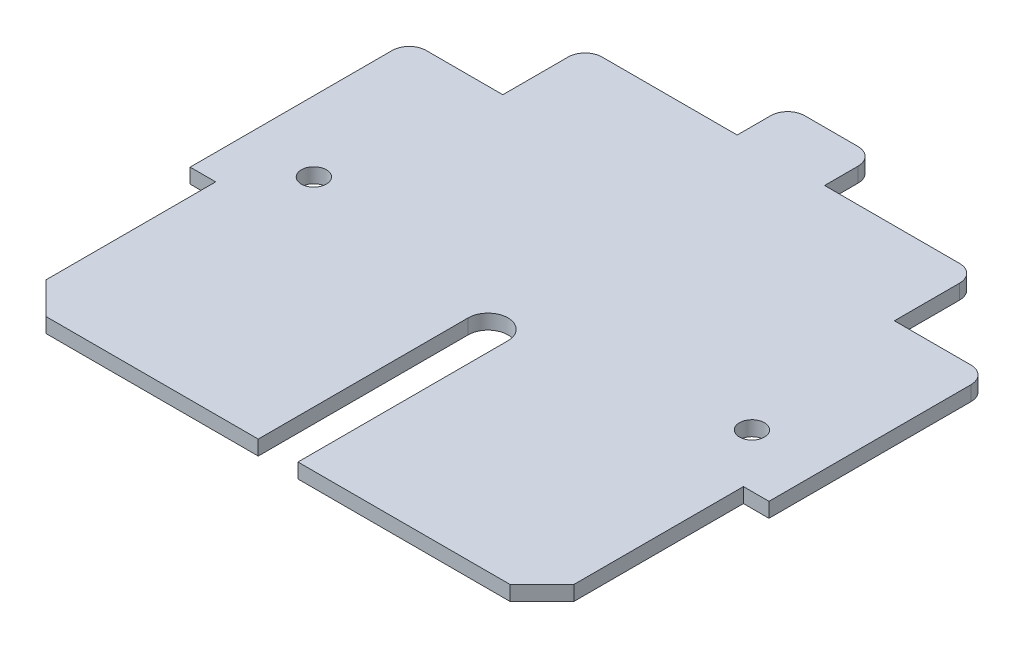
ISO-10303-21;
HEADER;
FILE_DESCRIPTION(('STEP AP214'),'2;1');
FILE_NAME('part.step','',(''),(''),'','','');
FILE_SCHEMA(('AUTOMOTIVE_DESIGN { 1 0 10303 214 1 1 1 1 }'));
ENDSEC;
DATA;
#1=APPLICATION_CONTEXT('core data for automotive mechanical design processes');
#2=APPLICATION_PROTOCOL_DEFINITION('international standard','automotive_design',2000,#1);
#3=PRODUCT_CONTEXT('',#1,'mechanical');
#4=PRODUCT('Part','Part','',(#3));
#5=PRODUCT_RELATED_PRODUCT_CATEGORY('part','',(#4));
#6=PRODUCT_DEFINITION_FORMATION('','',#4);
#7=PRODUCT_DEFINITION_CONTEXT('part definition',#1,'design');
#8=PRODUCT_DEFINITION('design','',#6,#7);
#9=PRODUCT_DEFINITION_SHAPE('','',#8);
#10=(LENGTH_UNIT() NAMED_UNIT(*) SI_UNIT(.MILLI.,.METRE.));
#11=(NAMED_UNIT(*) PLANE_ANGLE_UNIT() SI_UNIT($,.RADIAN.));
#12=(NAMED_UNIT(*) SI_UNIT($,.STERADIAN.) SOLID_ANGLE_UNIT());
#13=UNCERTAINTY_MEASURE_WITH_UNIT(LENGTH_MEASURE(1.E-05),#10,'distance_accuracy_value','');
#14=(GEOMETRIC_REPRESENTATION_CONTEXT(3) GLOBAL_UNCERTAINTY_ASSIGNED_CONTEXT((#13)) GLOBAL_UNIT_ASSIGNED_CONTEXT((#10,
#11,#12)) REPRESENTATION_CONTEXT('',''));
#15=CARTESIAN_POINT('',(0.,0.,0.));
#16=DIRECTION('',(0.,0.,1.));
#17=DIRECTION('',(1.,0.,0.));
#18=AXIS2_PLACEMENT_3D('',#15,#16,#17);
#19=CARTESIAN_POINT('',(24.,0.65,-11.175));
#20=DIRECTION('',(0.,1.,0.));
#21=DIRECTION('',(0.,0.,1.));
#22=AXIS2_PLACEMENT_3D('',#19,#20,#21);
#23=PLANE('',#22);
#24=CARTESIAN_POINT('',(19.3,0.65,1.925));
#25=DIRECTION('',(0.,1.,0.));
#26=DIRECTION('',(0.,0.,1.));
#27=AXIS2_PLACEMENT_3D('',#24,#25,#26);
#28=CIRCLE('',#27,1.1);
#29=CARTESIAN_POINT('',(19.3,0.65,3.025));
#30=VERTEX_POINT('',#29);
#31=EDGE_CURVE('E264',#30,#30,#28,.T.);
#32=ORIENTED_EDGE('',*,*,#31,.F.);
#33=EDGE_LOOP('',(#32));
#34=FACE_BOUND('',#33,.T.);
#35=DIRECTION('',(1.,0.,0.));
#36=VECTOR('',#35,1.);
#37=CARTESIAN_POINT('',(1.75000000000001,0.65,24.375));
#38=LINE('',#37,#36);
#39=CARTESIAN_POINT('',(1.75000000000001,0.65,24.375));
#40=VERTEX_POINT('',#39);
#41=CARTESIAN_POINT('',(20.45,0.65,24.375));
#42=VERTEX_POINT('',#41);
#43=EDGE_CURVE('E344',#40,#42,#38,.T.);
#44=ORIENTED_EDGE('',*,*,#43,.T.);
#45=DIRECTION('',(0.707106781186545,0.,-0.70710678118655));
#46=VECTOR('',#45,1.);
#47=CARTESIAN_POINT('',(20.45,0.65,24.375));
#48=LINE('',#47,#46);
#49=CARTESIAN_POINT('',(23.25,0.65,21.575));
#50=VERTEX_POINT('',#49);
#51=EDGE_CURVE('E157',#42,#50,#48,.T.);
#52=ORIENTED_EDGE('',*,*,#51,.T.);
#53=DIRECTION('',(0.,0.,-1.));
#54=VECTOR('',#53,1.);
#55=CARTESIAN_POINT('',(23.25,0.65,21.575));
#56=LINE('',#55,#54);
#57=CARTESIAN_POINT('',(23.25,0.65,6.625));
#58=VERTEX_POINT('',#57);
#59=EDGE_CURVE('E445',#50,#58,#56,.T.);
#60=ORIENTED_EDGE('',*,*,#59,.T.);
#61=DIRECTION('',(1.,0.,0.));
#62=VECTOR('',#61,1.);
#63=CARTESIAN_POINT('',(23.25,0.65,6.625));
#64=LINE('',#63,#62);
#65=CARTESIAN_POINT('',(25.5,0.65,6.625));
#66=VERTEX_POINT('',#65);
#67=EDGE_CURVE('E467',#58,#66,#64,.T.);
#68=ORIENTED_EDGE('',*,*,#67,.T.);
#69=DIRECTION('',(0.,0.,-1.));
#70=VECTOR('',#69,1.);
#71=CARTESIAN_POINT('',(25.5,0.65,-11.175));
#72=LINE('',#71,#70);
#73=CARTESIAN_POINT('',(25.5,0.65,-11.175));
#74=VERTEX_POINT('',#73);
#75=EDGE_CURVE('E463',#66,#74,#72,.T.);
#76=ORIENTED_EDGE('',*,*,#75,.T.);
#77=CARTESIAN_POINT('',(24.,0.65,-11.175));
#78=DIRECTION('',(0.,1.,0.));
#79=DIRECTION('',(0.,0.,1.));
#80=AXIS2_PLACEMENT_3D('',#77,#78,#79);
#81=CIRCLE('',#80,1.5);
#82=CARTESIAN_POINT('',(24.,0.65,-12.675));
#83=VERTEX_POINT('',#82);
#84=EDGE_CURVE('E466',#74,#83,#81,.T.);
#85=ORIENTED_EDGE('',*,*,#84,.T.);
#86=DIRECTION('',(-1.,0.,0.));
#87=VECTOR('',#86,1.);
#88=CARTESIAN_POINT('',(24.,0.65,-12.675));
#89=LINE('',#88,#87);
#90=CARTESIAN_POINT('',(17.25,0.65,-12.675));
#91=VERTEX_POINT('',#90);
#92=EDGE_CURVE('E472',#83,#91,#89,.T.);
#93=ORIENTED_EDGE('',*,*,#92,.T.);
#94=DIRECTION('',(0.,0.,-1.));
#95=VECTOR('',#94,1.);
#96=CARTESIAN_POINT('',(17.25,0.65,-12.675));
#97=LINE('',#96,#95);
#98=CARTESIAN_POINT('',(17.25,0.65,-18.425));
#99=VERTEX_POINT('',#98);
#100=EDGE_CURVE('E479',#91,#99,#97,.T.);
#101=ORIENTED_EDGE('',*,*,#100,.T.);
#102=CARTESIAN_POINT('',(15.75,0.65,-18.425));
#103=DIRECTION('',(0.,1.,0.));
#104=DIRECTION('',(0.,0.,1.));
#105=AXIS2_PLACEMENT_3D('',#102,#103,#104);
#106=CIRCLE('',#105,1.5);
#107=CARTESIAN_POINT('',(15.75,0.65,-19.925));
#108=VERTEX_POINT('',#107);
#109=EDGE_CURVE('E482',#99,#108,#106,.T.);
#110=ORIENTED_EDGE('',*,*,#109,.T.);
#111=DIRECTION('',(-1.,0.,0.));
#112=VECTOR('',#111,1.);
#113=CARTESIAN_POINT('',(15.75,0.65,-19.925));
#114=LINE('',#113,#112);
#115=CARTESIAN_POINT('',(3.85,0.65,-19.925));
#116=VERTEX_POINT('',#115);
#117=EDGE_CURVE('E485',#108,#116,#114,.T.);
#118=ORIENTED_EDGE('',*,*,#117,.T.);
#119=DIRECTION('',(0.,0.,-1.));
#120=VECTOR('',#119,1.);
#121=CARTESIAN_POINT('',(3.85,0.65,-19.925));
#122=LINE('',#121,#120);
#123=CARTESIAN_POINT('',(3.85,0.65,-22.875));
#124=VERTEX_POINT('',#123);
#125=EDGE_CURVE('E488',#116,#124,#122,.T.);
#126=ORIENTED_EDGE('',*,*,#125,.T.);
#127=CARTESIAN_POINT('',(2.35,0.65,-22.875));
#128=DIRECTION('',(0.,1.,0.));
#129=DIRECTION('',(0.,0.,-1.));
#130=AXIS2_PLACEMENT_3D('',#127,#128,#129);
#131=CIRCLE('',#130,1.5);
#132=CARTESIAN_POINT('',(2.34999999999999,0.65,-24.375));
#133=VERTEX_POINT('',#132);
#134=EDGE_CURVE('E491',#124,#133,#131,.T.);
#135=ORIENTED_EDGE('',*,*,#134,.T.);
#136=DIRECTION('',(-1.,0.,0.));
#137=VECTOR('',#136,1.);
#138=CARTESIAN_POINT('',(-2.34999999999999,0.65,-24.375));
#139=LINE('',#138,#137);
#140=CARTESIAN_POINT('',(-2.34999999999999,0.65,-24.375));
#141=VERTEX_POINT('',#140);
#142=EDGE_CURVE('E494',#133,#141,#139,.T.);
#143=ORIENTED_EDGE('',*,*,#142,.T.);
#144=CARTESIAN_POINT('',(-2.35,0.65,-22.875));
#145=DIRECTION('',(0.,1.,0.));
#146=DIRECTION('',(0.,0.,-1.));
#147=AXIS2_PLACEMENT_3D('',#144,#145,#146);
#148=CIRCLE('',#147,1.5);
#149=CARTESIAN_POINT('',(-3.85,0.65,-22.875));
#150=VERTEX_POINT('',#149);
#151=EDGE_CURVE('E497',#141,#150,#148,.T.);
#152=ORIENTED_EDGE('',*,*,#151,.T.);
#153=DIRECTION('',(0.,0.,1.));
#154=VECTOR('',#153,1.);
#155=CARTESIAN_POINT('',(-3.85,0.65,-19.925));
#156=LINE('',#155,#154);
#157=CARTESIAN_POINT('',(-3.85,0.65,-19.925));
#158=VERTEX_POINT('',#157);
#159=EDGE_CURVE('E500',#150,#158,#156,.T.);
#160=ORIENTED_EDGE('',*,*,#159,.T.);
#161=DIRECTION('',(-1.,0.,0.));
#162=VECTOR('',#161,1.);
#163=CARTESIAN_POINT('',(-15.75,0.65,-19.925));
#164=LINE('',#163,#162);
#165=CARTESIAN_POINT('',(-15.75,0.65,-19.925));
#166=VERTEX_POINT('',#165);
#167=EDGE_CURVE('E503',#158,#166,#164,.T.);
#168=ORIENTED_EDGE('',*,*,#167,.T.);
#169=CARTESIAN_POINT('',(-15.75,0.65,-18.425));
#170=DIRECTION('',(0.,1.,0.));
#171=DIRECTION('',(0.,0.,-1.));
#172=AXIS2_PLACEMENT_3D('',#169,#170,#171);
#173=CIRCLE('',#172,1.5);
#174=CARTESIAN_POINT('',(-17.25,0.65,-18.425));
#175=VERTEX_POINT('',#174);
#176=EDGE_CURVE('E506',#166,#175,#173,.T.);
#177=ORIENTED_EDGE('',*,*,#176,.T.);
#178=DIRECTION('',(0.,0.,1.));
#179=VECTOR('',#178,1.);
#180=CARTESIAN_POINT('',(-17.25,0.65,-12.675));
#181=LINE('',#180,#179);
#182=CARTESIAN_POINT('',(-17.25,0.65,-12.675));
#183=VERTEX_POINT('',#182);
#184=EDGE_CURVE('E509',#175,#183,#181,.T.);
#185=ORIENTED_EDGE('',*,*,#184,.T.);
#186=DIRECTION('',(-1.,0.,0.));
#187=VECTOR('',#186,1.);
#188=CARTESIAN_POINT('',(-24.,0.65,-12.675));
#189=LINE('',#188,#187);
#190=CARTESIAN_POINT('',(-24.,0.65,-12.675));
#191=VERTEX_POINT('',#190);
#192=EDGE_CURVE('E512',#183,#191,#189,.T.);
#193=ORIENTED_EDGE('',*,*,#192,.T.);
#194=CARTESIAN_POINT('',(-24.,0.65,-11.175));
#195=DIRECTION('',(0.,1.,0.));
#196=DIRECTION('',(0.,0.,-1.));
#197=AXIS2_PLACEMENT_3D('',#194,#195,#196);
#198=CIRCLE('',#197,1.5);
#199=CARTESIAN_POINT('',(-25.5,0.65,-11.175));
#200=VERTEX_POINT('',#199);
#201=EDGE_CURVE('E515',#191,#200,#198,.T.);
#202=ORIENTED_EDGE('',*,*,#201,.T.);
#203=DIRECTION('',(0.,0.,1.));
#204=VECTOR('',#203,1.);
#205=CARTESIAN_POINT('',(-25.5,0.65,-11.175));
#206=LINE('',#205,#204);
#207=CARTESIAN_POINT('',(-25.5,0.65,6.62500000000001));
#208=VERTEX_POINT('',#207);
#209=EDGE_CURVE('E518',#200,#208,#206,.T.);
#210=ORIENTED_EDGE('',*,*,#209,.T.);
#211=DIRECTION('',(1.,0.,0.));
#212=VECTOR('',#211,1.);
#213=CARTESIAN_POINT('',(-23.25,0.65,6.62500000000001));
#214=LINE('',#213,#212);
#215=CARTESIAN_POINT('',(-23.25,0.65,6.62500000000001));
#216=VERTEX_POINT('',#215);
#217=EDGE_CURVE('E521',#208,#216,#214,.T.);
#218=ORIENTED_EDGE('',*,*,#217,.T.);
#219=DIRECTION('',(0.,0.,1.));
#220=VECTOR('',#219,1.);
#221=CARTESIAN_POINT('',(-23.25,0.65,6.62500000000001));
#222=LINE('',#221,#220);
#223=CARTESIAN_POINT('',(-23.25,0.65,21.575));
#224=VERTEX_POINT('',#223);
#225=EDGE_CURVE('E524',#216,#224,#222,.T.);
#226=ORIENTED_EDGE('',*,*,#225,.T.);
#227=DIRECTION('',(0.707106781186547,0.,0.707106781186548));
#228=VECTOR('',#227,1.);
#229=CARTESIAN_POINT('',(-20.45,0.65,24.375));
#230=LINE('',#229,#228);
#231=CARTESIAN_POINT('',(-20.45,0.65,24.375));
#232=VERTEX_POINT('',#231);
#233=EDGE_CURVE('E527',#224,#232,#230,.T.);
#234=ORIENTED_EDGE('',*,*,#233,.T.);
#235=DIRECTION('',(1.,0.,0.));
#236=VECTOR('',#235,1.);
#237=CARTESIAN_POINT('',(-20.45,0.65,24.375));
#238=LINE('',#237,#236);
#239=CARTESIAN_POINT('',(-1.75,0.65,24.375));
#240=VERTEX_POINT('',#239);
#241=EDGE_CURVE('E236',#232,#240,#238,.T.);
#242=ORIENTED_EDGE('',*,*,#241,.T.);
#243=DIRECTION('',(0.,0.,-1.));
#244=VECTOR('',#243,1.);
#245=CARTESIAN_POINT('',(-1.75,0.65,24.375));
#246=LINE('',#245,#244);
#247=CARTESIAN_POINT('',(-1.75,0.65,5.875));
#248=VERTEX_POINT('',#247);
#249=EDGE_CURVE('E230',#240,#248,#246,.T.);
#250=ORIENTED_EDGE('',*,*,#249,.T.);
#251=CARTESIAN_POINT('',(0.,0.65,5.875));
#252=DIRECTION('',(0.,-1.,0.));
#253=DIRECTION('',(0.,0.,1.));
#254=AXIS2_PLACEMENT_3D('',#251,#252,#253);
#255=CIRCLE('',#254,1.75000000000001);
#256=CARTESIAN_POINT('',(1.75000000000001,0.65,5.875));
#257=VERTEX_POINT('',#256);
#258=EDGE_CURVE('E234',#248,#257,#255,.T.);
#259=ORIENTED_EDGE('',*,*,#258,.T.);
#260=DIRECTION('',(0.,0.,1.));
#261=VECTOR('',#260,1.);
#262=CARTESIAN_POINT('',(1.75000000000001,0.65,24.375));
#263=LINE('',#262,#261);
#264=EDGE_CURVE('E54',#257,#40,#263,.T.);
#265=ORIENTED_EDGE('',*,*,#264,.T.);
#266=EDGE_LOOP('',(#44,#52,#60,#68,#76,#85,#93,#101,#110,#118,#126,#135,#143,#152,#160,#168,
#177,#185,#193,#202,#210,#218,#226,#234,#242,#250,#259,#265));
#267=FACE_BOUND('',#266,.T.);
#268=CARTESIAN_POINT('',(-19.3,0.65,1.92500000000001));
#269=DIRECTION('',(0.,1.,0.));
#270=DIRECTION('',(0.,0.,-1.));
#271=AXIS2_PLACEMENT_3D('',#268,#269,#270);
#272=CIRCLE('',#271,1.1);
#273=CARTESIAN_POINT('',(-19.3,0.65,0.825000000000007));
#274=VERTEX_POINT('',#273);
#275=EDGE_CURVE('E945',#274,#274,#272,.T.);
#276=ORIENTED_EDGE('',*,*,#275,.F.);
#277=EDGE_LOOP('',(#276));
#278=FACE_BOUND('',#277,.T.);
#279=ADVANCED_FACE('F36',(#34,#267,#278),#23,.T.);
#280=CARTESIAN_POINT('',(24.,-0.65,-11.175));
#281=DIRECTION('',(0.,1.,0.));
#282=DIRECTION('',(0.,0.,1.));
#283=AXIS2_PLACEMENT_3D('',#280,#281,#282);
#284=PLANE('',#283);
#285=DIRECTION('',(1.,0.,0.));
#286=VECTOR('',#285,1.);
#287=CARTESIAN_POINT('',(1.75000000000001,-0.65,24.375));
#288=LINE('',#287,#286);
#289=CARTESIAN_POINT('',(1.75000000000001,-0.65,24.375));
#290=VERTEX_POINT('',#289);
#291=CARTESIAN_POINT('',(20.45,-0.65,24.375));
#292=VERTEX_POINT('',#291);
#293=EDGE_CURVE('E259',#290,#292,#288,.T.);
#294=ORIENTED_EDGE('',*,*,#293,.F.);
#295=DIRECTION('',(0.,0.,1.));
#296=VECTOR('',#295,1.);
#297=CARTESIAN_POINT('',(1.75000000000001,-0.65,24.375));
#298=LINE('',#297,#296);
#299=CARTESIAN_POINT('',(1.75000000000001,-0.65,5.875));
#300=VERTEX_POINT('',#299);
#301=EDGE_CURVE('E149',#300,#290,#298,.T.);
#302=ORIENTED_EDGE('',*,*,#301,.F.);
#303=CARTESIAN_POINT('',(0.,-0.65,5.875));
#304=DIRECTION('',(0.,-1.,0.));
#305=DIRECTION('',(0.,0.,1.));
#306=AXIS2_PLACEMENT_3D('',#303,#304,#305);
#307=CIRCLE('',#306,1.75000000000001);
#308=CARTESIAN_POINT('',(-1.75,-0.65,5.875));
#309=VERTEX_POINT('',#308);
#310=EDGE_CURVE('E143',#309,#300,#307,.T.);
#311=ORIENTED_EDGE('',*,*,#310,.F.);
#312=DIRECTION('',(0.,0.,-1.));
#313=VECTOR('',#312,1.);
#314=CARTESIAN_POINT('',(-1.75,-0.65,24.375));
#315=LINE('',#314,#313);
#316=CARTESIAN_POINT('',(-1.75,-0.65,24.375));
#317=VERTEX_POINT('',#316);
#318=EDGE_CURVE('E245',#317,#309,#315,.T.);
#319=ORIENTED_EDGE('',*,*,#318,.F.);
#320=DIRECTION('',(1.,0.,0.));
#321=VECTOR('',#320,1.);
#322=CARTESIAN_POINT('',(-20.45,-0.65,24.375));
#323=LINE('',#322,#321);
#324=CARTESIAN_POINT('',(-20.45,-0.65,24.375));
#325=VERTEX_POINT('',#324);
#326=EDGE_CURVE('E335',#325,#317,#323,.T.);
#327=ORIENTED_EDGE('',*,*,#326,.F.);
#328=DIRECTION('',(0.707106781186547,0.,0.707106781186548));
#329=VECTOR('',#328,1.);
#330=CARTESIAN_POINT('',(-20.45,-0.65,24.375));
#331=LINE('',#330,#329);
#332=CARTESIAN_POINT('',(-23.25,-0.65,21.575));
#333=VERTEX_POINT('',#332);
#334=EDGE_CURVE('E332',#333,#325,#331,.T.);
#335=ORIENTED_EDGE('',*,*,#334,.F.);
#336=DIRECTION('',(0.,0.,1.));
#337=VECTOR('',#336,1.);
#338=CARTESIAN_POINT('',(-23.25,-0.65,21.575));
#339=LINE('',#338,#337);
#340=CARTESIAN_POINT('',(-23.25,-0.65,6.62500000000001));
#341=VERTEX_POINT('',#340);
#342=EDGE_CURVE('E329',#341,#333,#339,.T.);
#343=ORIENTED_EDGE('',*,*,#342,.F.);
#344=DIRECTION('',(1.,0.,0.));
#345=VECTOR('',#344,1.);
#346=CARTESIAN_POINT('',(-23.25,-0.65,6.62500000000001));
#347=LINE('',#346,#345);
#348=CARTESIAN_POINT('',(-25.5,-0.65,6.62500000000001));
#349=VERTEX_POINT('',#348);
#350=EDGE_CURVE('E325',#349,#341,#347,.T.);
#351=ORIENTED_EDGE('',*,*,#350,.F.);
#352=DIRECTION('',(0.,0.,1.));
#353=VECTOR('',#352,1.);
#354=CARTESIAN_POINT('',(-25.5,-0.65,-11.175));
#355=LINE('',#354,#353);
#356=CARTESIAN_POINT('',(-25.5,-0.65,-11.175));
#357=VERTEX_POINT('',#356);
#358=EDGE_CURVE('E322',#357,#349,#355,.T.);
#359=ORIENTED_EDGE('',*,*,#358,.F.);
#360=CARTESIAN_POINT('',(-24.,-0.65,-11.175));
#361=DIRECTION('',(0.,1.,0.));
#362=DIRECTION('',(0.,0.,-1.));
#363=AXIS2_PLACEMENT_3D('',#360,#361,#362);
#364=CIRCLE('',#363,1.5);
#365=CARTESIAN_POINT('',(-24.,-0.65,-12.675));
#366=VERTEX_POINT('',#365);
#367=EDGE_CURVE('E319',#366,#357,#364,.T.);
#368=ORIENTED_EDGE('',*,*,#367,.F.);
#369=DIRECTION('',(-1.,0.,0.));
#370=VECTOR('',#369,1.);
#371=CARTESIAN_POINT('',(-24.,-0.65,-12.675));
#372=LINE('',#371,#370);
#373=CARTESIAN_POINT('',(-17.25,-0.65,-12.675));
#374=VERTEX_POINT('',#373);
#375=EDGE_CURVE('E316',#374,#366,#372,.T.);
#376=ORIENTED_EDGE('',*,*,#375,.F.);
#377=DIRECTION('',(0.,0.,1.));
#378=VECTOR('',#377,1.);
#379=CARTESIAN_POINT('',(-17.25,-0.65,-12.675));
#380=LINE('',#379,#378);
#381=CARTESIAN_POINT('',(-17.25,-0.65,-18.425));
#382=VERTEX_POINT('',#381);
#383=EDGE_CURVE('E313',#382,#374,#380,.T.);
#384=ORIENTED_EDGE('',*,*,#383,.F.);
#385=CARTESIAN_POINT('',(-15.75,-0.65,-18.425));
#386=DIRECTION('',(0.,1.,0.));
#387=DIRECTION('',(0.,0.,-1.));
#388=AXIS2_PLACEMENT_3D('',#385,#386,#387);
#389=CIRCLE('',#388,1.5);
#390=CARTESIAN_POINT('',(-15.75,-0.65,-19.925));
#391=VERTEX_POINT('',#390);
#392=EDGE_CURVE('E310',#391,#382,#389,.T.);
#393=ORIENTED_EDGE('',*,*,#392,.F.);
#394=DIRECTION('',(-1.,0.,0.));
#395=VECTOR('',#394,1.);
#396=CARTESIAN_POINT('',(-15.75,-0.65,-19.925));
#397=LINE('',#396,#395);
#398=CARTESIAN_POINT('',(-3.85,-0.65,-19.925));
#399=VERTEX_POINT('',#398);
#400=EDGE_CURVE('E307',#399,#391,#397,.T.);
#401=ORIENTED_EDGE('',*,*,#400,.F.);
#402=DIRECTION('',(0.,0.,1.));
#403=VECTOR('',#402,1.);
#404=CARTESIAN_POINT('',(-3.85,-0.65,-19.925));
#405=LINE('',#404,#403);
#406=CARTESIAN_POINT('',(-3.85,-0.65,-22.875));
#407=VERTEX_POINT('',#406);
#408=EDGE_CURVE('E304',#407,#399,#405,.T.);
#409=ORIENTED_EDGE('',*,*,#408,.F.);
#410=CARTESIAN_POINT('',(-2.35,-0.65,-22.875));
#411=DIRECTION('',(0.,1.,0.));
#412=DIRECTION('',(0.,0.,-1.));
#413=AXIS2_PLACEMENT_3D('',#410,#411,#412);
#414=CIRCLE('',#413,1.5);
#415=CARTESIAN_POINT('',(-2.34999999999999,-0.65,-24.375));
#416=VERTEX_POINT('',#415);
#417=EDGE_CURVE('E301',#416,#407,#414,.T.);
#418=ORIENTED_EDGE('',*,*,#417,.F.);
#419=DIRECTION('',(-1.,0.,0.));
#420=VECTOR('',#419,1.);
#421=CARTESIAN_POINT('',(-2.34999999999999,-0.65,-24.375));
#422=LINE('',#421,#420);
#423=CARTESIAN_POINT('',(2.34999999999999,-0.65,-24.375));
#424=VERTEX_POINT('',#423);
#425=EDGE_CURVE('E298',#424,#416,#422,.T.);
#426=ORIENTED_EDGE('',*,*,#425,.F.);
#427=CARTESIAN_POINT('',(2.35,-0.65,-22.875));
#428=DIRECTION('',(0.,1.,0.));
#429=DIRECTION('',(0.,0.,-1.));
#430=AXIS2_PLACEMENT_3D('',#427,#428,#429);
#431=CIRCLE('',#430,1.5);
#432=CARTESIAN_POINT('',(3.85,-0.65,-22.875));
#433=VERTEX_POINT('',#432);
#434=EDGE_CURVE('E295',#433,#424,#431,.T.);
#435=ORIENTED_EDGE('',*,*,#434,.F.);
#436=DIRECTION('',(0.,0.,-1.));
#437=VECTOR('',#436,1.);
#438=CARTESIAN_POINT('',(3.85,-0.65,-19.925));
#439=LINE('',#438,#437);
#440=CARTESIAN_POINT('',(3.85,-0.65,-19.925));
#441=VERTEX_POINT('',#440);
#442=EDGE_CURVE('E292',#441,#433,#439,.T.);
#443=ORIENTED_EDGE('',*,*,#442,.F.);
#444=DIRECTION('',(-1.,0.,0.));
#445=VECTOR('',#444,1.);
#446=CARTESIAN_POINT('',(15.75,-0.65,-19.925));
#447=LINE('',#446,#445);
#448=CARTESIAN_POINT('',(15.75,-0.65,-19.925));
#449=VERTEX_POINT('',#448);
#450=EDGE_CURVE('E289',#449,#441,#447,.T.);
#451=ORIENTED_EDGE('',*,*,#450,.F.);
#452=CARTESIAN_POINT('',(15.75,-0.65,-18.425));
#453=DIRECTION('',(0.,1.,0.));
#454=DIRECTION('',(0.,0.,1.));
#455=AXIS2_PLACEMENT_3D('',#452,#453,#454);
#456=CIRCLE('',#455,1.5);
#457=CARTESIAN_POINT('',(17.25,-0.65,-18.425));
#458=VERTEX_POINT('',#457);
#459=EDGE_CURVE('E286',#458,#449,#456,.T.);
#460=ORIENTED_EDGE('',*,*,#459,.F.);
#461=DIRECTION('',(0.,0.,-1.));
#462=VECTOR('',#461,1.);
#463=CARTESIAN_POINT('',(17.25,-0.65,-12.675));
#464=LINE('',#463,#462);
#465=CARTESIAN_POINT('',(17.25,-0.65,-12.675));
#466=VERTEX_POINT('',#465);
#467=EDGE_CURVE('E283',#466,#458,#464,.T.);
#468=ORIENTED_EDGE('',*,*,#467,.F.);
#469=DIRECTION('',(-1.,0.,0.));
#470=VECTOR('',#469,1.);
#471=CARTESIAN_POINT('',(24.,-0.65,-12.675));
#472=LINE('',#471,#470);
#473=CARTESIAN_POINT('',(24.,-0.65,-12.675));
#474=VERTEX_POINT('',#473);
#475=EDGE_CURVE('E280',#474,#466,#472,.T.);
#476=ORIENTED_EDGE('',*,*,#475,.F.);
#477=CARTESIAN_POINT('',(24.,-0.65,-11.175));
#478=DIRECTION('',(0.,1.,0.));
#479=DIRECTION('',(0.,0.,1.));
#480=AXIS2_PLACEMENT_3D('',#477,#478,#479);
#481=CIRCLE('',#480,1.5);
#482=CARTESIAN_POINT('',(25.5,-0.65,-11.175));
#483=VERTEX_POINT('',#482);
#484=EDGE_CURVE('E277',#483,#474,#481,.T.);
#485=ORIENTED_EDGE('',*,*,#484,.F.);
#486=DIRECTION('',(0.,0.,-1.));
#487=VECTOR('',#486,1.);
#488=CARTESIAN_POINT('',(25.5,-0.65,-11.175));
#489=LINE('',#488,#487);
#490=CARTESIAN_POINT('',(25.5,-0.65,6.625));
#491=VERTEX_POINT('',#490);
#492=EDGE_CURVE('E274',#491,#483,#489,.T.);
#493=ORIENTED_EDGE('',*,*,#492,.F.);
#494=DIRECTION('',(1.,0.,0.));
#495=VECTOR('',#494,1.);
#496=CARTESIAN_POINT('',(23.25,-0.65,6.625));
#497=LINE('',#496,#495);
#498=CARTESIAN_POINT('',(23.25,-0.65,6.625));
#499=VERTEX_POINT('',#498);
#500=EDGE_CURVE('E271',#499,#491,#497,.T.);
#501=ORIENTED_EDGE('',*,*,#500,.F.);
#502=DIRECTION('',(0.,0.,-1.));
#503=VECTOR('',#502,1.);
#504=CARTESIAN_POINT('',(23.25,-0.65,8.875));
#505=LINE('',#504,#503);
#506=CARTESIAN_POINT('',(23.25,-0.65,21.575));
#507=VERTEX_POINT('',#506);
#508=EDGE_CURVE('E268',#507,#499,#505,.T.);
#509=ORIENTED_EDGE('',*,*,#508,.F.);
#510=DIRECTION('',(0.707106781186545,0.,-0.70710678118655));
#511=VECTOR('',#510,1.);
#512=CARTESIAN_POINT('',(20.45,-0.65,24.375));
#513=LINE('',#512,#511);
#514=EDGE_CURVE('E263',#292,#507,#513,.T.);
#515=ORIENTED_EDGE('',*,*,#514,.F.);
#516=EDGE_LOOP('',(#294,#302,#311,#319,#327,#335,#343,#351,#359,#368,#376,#384,#393,#401,#409,
#418,#426,#435,#443,#451,#460,#468,#476,#485,#493,#501,#509,#515));
#517=FACE_BOUND('',#516,.T.);
#518=CARTESIAN_POINT('',(19.3,-0.65,1.925));
#519=DIRECTION('',(0.,1.,0.));
#520=DIRECTION('',(0.,0.,1.));
#521=AXIS2_PLACEMENT_3D('',#518,#519,#520);
#522=CIRCLE('',#521,1.1);
#523=CARTESIAN_POINT('',(19.3,-0.65,3.025));
#524=VERTEX_POINT('',#523);
#525=EDGE_CURVE('E937',#524,#524,#522,.T.);
#526=ORIENTED_EDGE('',*,*,#525,.T.);
#527=EDGE_LOOP('',(#526));
#528=FACE_BOUND('',#527,.T.);
#529=CARTESIAN_POINT('',(-19.3,-0.65,1.92500000000001));
#530=DIRECTION('',(0.,1.,0.));
#531=DIRECTION('',(0.,0.,-1.));
#532=AXIS2_PLACEMENT_3D('',#529,#530,#531);
#533=CIRCLE('',#532,1.1);
#534=CARTESIAN_POINT('',(-19.3,-0.65,0.825000000000007));
#535=VERTEX_POINT('',#534);
#536=EDGE_CURVE('E949',#535,#535,#533,.T.);
#537=ORIENTED_EDGE('',*,*,#536,.T.);
#538=EDGE_LOOP('',(#537));
#539=FACE_BOUND('',#538,.T.);
#540=ADVANCED_FACE('F450',(#517,#528,#539),#284,.F.);
#541=CARTESIAN_POINT('',(1.75000000000001,0.65,24.375));
#542=DIRECTION('',(0.,0.,-1.));
#543=DIRECTION('',(-1.,0.,0.));
#544=AXIS2_PLACEMENT_3D('',#541,#542,#543);
#545=PLANE('',#544);
#546=ORIENTED_EDGE('',*,*,#293,.T.);
#547=DIRECTION('',(0.,-1.,0.));
#548=VECTOR('',#547,1.);
#549=CARTESIAN_POINT('',(20.45,0.65,24.375));
#550=LINE('',#549,#548);
#551=EDGE_CURVE('E11',#42,#292,#550,.T.);
#552=ORIENTED_EDGE('',*,*,#551,.F.);
#553=ORIENTED_EDGE('',*,*,#43,.F.);
#554=DIRECTION('',(0.,-1.,0.));
#555=VECTOR('',#554,1.);
#556=CARTESIAN_POINT('',(1.75000000000001,0.65,24.375));
#557=LINE('',#556,#555);
#558=EDGE_CURVE('E255',#40,#290,#557,.T.);
#559=ORIENTED_EDGE('',*,*,#558,.T.);
#560=EDGE_LOOP('',(#546,#552,#553,#559));
#561=FACE_BOUND('',#560,.T.);
#562=ADVANCED_FACE('F38',(#561),#545,.F.);
#563=CARTESIAN_POINT('',(20.45,0.65,24.375));
#564=DIRECTION('',(-0.70710678118655,0.,-0.707106781186545));
#565=DIRECTION('',(-0.707106781186545,0.,0.70710678118655));
#566=AXIS2_PLACEMENT_3D('',#563,#564,#565);
#567=PLANE('',#566);
#568=ORIENTED_EDGE('',*,*,#514,.T.);
#569=DIRECTION('',(0.,-1.,0.));
#570=VECTOR('',#569,1.);
#571=CARTESIAN_POINT('',(23.25,0.65,21.575));
#572=LINE('',#571,#570);
#573=EDGE_CURVE('E46',#50,#507,#572,.T.);
#574=ORIENTED_EDGE('',*,*,#573,.F.);
#575=ORIENTED_EDGE('',*,*,#51,.F.);
#576=ORIENTED_EDGE('',*,*,#551,.T.);
#577=EDGE_LOOP('',(#568,#574,#575,#576));
#578=FACE_BOUND('',#577,.T.);
#579=ADVANCED_FACE('F446',(#578),#567,.F.);
#580=CARTESIAN_POINT('',(23.25,0.65,8.875));
#581=DIRECTION('',(-1.,0.,0.));
#582=DIRECTION('',(0.,0.,1.));
#583=AXIS2_PLACEMENT_3D('',#580,#581,#582);
#584=PLANE('',#583);
#585=ORIENTED_EDGE('',*,*,#508,.T.);
#586=DIRECTION('',(0.,-1.,0.));
#587=VECTOR('',#586,1.);
#588=CARTESIAN_POINT('',(23.25,0.65,6.625));
#589=LINE('',#588,#587);
#590=EDGE_CURVE('E435',#58,#499,#589,.T.);
#591=ORIENTED_EDGE('',*,*,#590,.F.);
#592=ORIENTED_EDGE('',*,*,#59,.F.);
#593=ORIENTED_EDGE('',*,*,#573,.T.);
#594=EDGE_LOOP('',(#585,#591,#592,#593));
#595=FACE_BOUND('',#594,.T.);
#596=ADVANCED_FACE('F443',(#595),#584,.F.);
#597=CARTESIAN_POINT('',(23.25,0.65,6.625));
#598=DIRECTION('',(0.,0.,-1.));
#599=DIRECTION('',(-1.,0.,0.));
#600=AXIS2_PLACEMENT_3D('',#597,#598,#599);
#601=PLANE('',#600);
#602=ORIENTED_EDGE('',*,*,#500,.T.);
#603=DIRECTION('',(0.,-1.,0.));
#604=VECTOR('',#603,1.);
#605=CARTESIAN_POINT('',(25.5,0.65,6.625));
#606=LINE('',#605,#604);
#607=EDGE_CURVE('E431',#66,#491,#606,.T.);
#608=ORIENTED_EDGE('',*,*,#607,.F.);
#609=ORIENTED_EDGE('',*,*,#67,.F.);
#610=ORIENTED_EDGE('',*,*,#590,.T.);
#611=EDGE_LOOP('',(#602,#608,#609,#610));
#612=FACE_BOUND('',#611,.T.);
#613=ADVANCED_FACE('F457',(#612),#601,.F.);
#614=CARTESIAN_POINT('',(25.5,0.65,-11.175));
#615=DIRECTION('',(-1.,0.,0.));
#616=DIRECTION('',(0.,0.,1.));
#617=AXIS2_PLACEMENT_3D('',#614,#615,#616);
#618=PLANE('',#617);
#619=ORIENTED_EDGE('',*,*,#492,.T.);
#620=DIRECTION('',(0.,-1.,0.));
#621=VECTOR('',#620,1.);
#622=CARTESIAN_POINT('',(25.5,0.65,-11.175));
#623=LINE('',#622,#621);
#624=EDGE_CURVE('E427',#74,#483,#623,.T.);
#625=ORIENTED_EDGE('',*,*,#624,.F.);
#626=ORIENTED_EDGE('',*,*,#75,.F.);
#627=ORIENTED_EDGE('',*,*,#607,.T.);
#628=EDGE_LOOP('',(#619,#625,#626,#627));
#629=FACE_BOUND('',#628,.T.);
#630=ADVANCED_FACE('F461',(#629),#618,.F.);
#631=CARTESIAN_POINT('',(24.,0.65,-11.175));
#632=DIRECTION('',(0.,-1.,0.));
#633=DIRECTION('',(0.,0.,-1.));
#634=AXIS2_PLACEMENT_3D('',#631,#632,#633);
#635=CYLINDRICAL_SURFACE('',#634,1.5);
#636=ORIENTED_EDGE('',*,*,#484,.T.);
#637=DIRECTION('',(0.,-1.,0.));
#638=VECTOR('',#637,1.);
#639=CARTESIAN_POINT('',(24.,0.65,-12.675));
#640=LINE('',#639,#638);
#641=EDGE_CURVE('E423',#83,#474,#640,.T.);
#642=ORIENTED_EDGE('',*,*,#641,.F.);
#643=ORIENTED_EDGE('',*,*,#84,.F.);
#644=ORIENTED_EDGE('',*,*,#624,.T.);
#645=EDGE_LOOP('',(#636,#642,#643,#644));
#646=FACE_BOUND('',#645,.T.);
#647=ADVANCED_FACE('F834',(#646),#635,.T.);
#648=CARTESIAN_POINT('',(24.,0.65,-12.675));
#649=DIRECTION('',(0.,0.,1.));
#650=DIRECTION('',(1.,0.,0.));
#651=AXIS2_PLACEMENT_3D('',#648,#649,#650);
#652=PLANE('',#651);
#653=ORIENTED_EDGE('',*,*,#475,.T.);
#654=DIRECTION('',(0.,-1.,0.));
#655=VECTOR('',#654,1.);
#656=CARTESIAN_POINT('',(17.25,0.65,-12.675));
#657=LINE('',#656,#655);
#658=EDGE_CURVE('E419',#91,#466,#657,.T.);
#659=ORIENTED_EDGE('',*,*,#658,.F.);
#660=ORIENTED_EDGE('',*,*,#92,.F.);
#661=ORIENTED_EDGE('',*,*,#641,.T.);
#662=EDGE_LOOP('',(#653,#659,#660,#661));
#663=FACE_BOUND('',#662,.T.);
#664=ADVANCED_FACE('F823',(#663),#652,.F.);
#665=CARTESIAN_POINT('',(17.25,0.65,-12.675));
#666=DIRECTION('',(-1.,0.,0.));
#667=DIRECTION('',(0.,0.,1.));
#668=AXIS2_PLACEMENT_3D('',#665,#666,#667);
#669=PLANE('',#668);
#670=ORIENTED_EDGE('',*,*,#467,.T.);
#671=DIRECTION('',(0.,-1.,0.));
#672=VECTOR('',#671,1.);
#673=CARTESIAN_POINT('',(17.25,0.65,-18.425));
#674=LINE('',#673,#672);
#675=EDGE_CURVE('E415',#99,#458,#674,.T.);
#676=ORIENTED_EDGE('',*,*,#675,.F.);
#677=ORIENTED_EDGE('',*,*,#100,.F.);
#678=ORIENTED_EDGE('',*,*,#658,.T.);
#679=EDGE_LOOP('',(#670,#676,#677,#678));
#680=FACE_BOUND('',#679,.T.);
#681=ADVANCED_FACE('F812',(#680),#669,.F.);
#682=CARTESIAN_POINT('',(15.75,0.65,-18.425));
#683=DIRECTION('',(0.,-1.,0.));
#684=DIRECTION('',(0.,0.,-1.));
#685=AXIS2_PLACEMENT_3D('',#682,#683,#684);
#686=CYLINDRICAL_SURFACE('',#685,1.5);
#687=ORIENTED_EDGE('',*,*,#459,.T.);
#688=DIRECTION('',(0.,-1.,0.));
#689=VECTOR('',#688,1.);
#690=CARTESIAN_POINT('',(15.75,0.65,-19.925));
#691=LINE('',#690,#689);
#692=EDGE_CURVE('E411',#108,#449,#691,.T.);
#693=ORIENTED_EDGE('',*,*,#692,.F.);
#694=ORIENTED_EDGE('',*,*,#109,.F.);
#695=ORIENTED_EDGE('',*,*,#675,.T.);
#696=EDGE_LOOP('',(#687,#693,#694,#695));
#697=FACE_BOUND('',#696,.T.);
#698=ADVANCED_FACE('F801',(#697),#686,.T.);
#699=CARTESIAN_POINT('',(15.75,0.65,-19.925));
#700=DIRECTION('',(0.,0.,1.));
#701=DIRECTION('',(1.,0.,0.));
#702=AXIS2_PLACEMENT_3D('',#699,#700,#701);
#703=PLANE('',#702);
#704=ORIENTED_EDGE('',*,*,#450,.T.);
#705=DIRECTION('',(0.,-1.,0.));
#706=VECTOR('',#705,1.);
#707=CARTESIAN_POINT('',(3.85,0.65,-19.925));
#708=LINE('',#707,#706);
#709=EDGE_CURVE('E407',#116,#441,#708,.T.);
#710=ORIENTED_EDGE('',*,*,#709,.F.);
#711=ORIENTED_EDGE('',*,*,#117,.F.);
#712=ORIENTED_EDGE('',*,*,#692,.T.);
#713=EDGE_LOOP('',(#704,#710,#711,#712));
#714=FACE_BOUND('',#713,.T.);
#715=ADVANCED_FACE('F790',(#714),#703,.F.);
#716=CARTESIAN_POINT('',(3.85,0.65,-19.925));
#717=DIRECTION('',(-1.,0.,0.));
#718=DIRECTION('',(0.,0.,1.));
#719=AXIS2_PLACEMENT_3D('',#716,#717,#718);
#720=PLANE('',#719);
#721=ORIENTED_EDGE('',*,*,#442,.T.);
#722=DIRECTION('',(0.,-1.,0.));
#723=VECTOR('',#722,1.);
#724=CARTESIAN_POINT('',(3.85,0.65,-22.875));
#725=LINE('',#724,#723);
#726=EDGE_CURVE('E403',#124,#433,#725,.T.);
#727=ORIENTED_EDGE('',*,*,#726,.F.);
#728=ORIENTED_EDGE('',*,*,#125,.F.);
#729=ORIENTED_EDGE('',*,*,#709,.T.);
#730=EDGE_LOOP('',(#721,#727,#728,#729));
#731=FACE_BOUND('',#730,.T.);
#732=ADVANCED_FACE('F779',(#731),#720,.F.);
#733=CARTESIAN_POINT('',(2.35,0.65,-22.875));
#734=DIRECTION('',(0.,-1.,0.));
#735=DIRECTION('',(0.,0.,-1.));
#736=AXIS2_PLACEMENT_3D('',#733,#734,#735);
#737=CYLINDRICAL_SURFACE('',#736,1.5);
#738=ORIENTED_EDGE('',*,*,#434,.T.);
#739=DIRECTION('',(0.,-1.,0.));
#740=VECTOR('',#739,1.);
#741=CARTESIAN_POINT('',(2.34999999999999,0.65,-24.375));
#742=LINE('',#741,#740);
#743=EDGE_CURVE('E399',#133,#424,#742,.T.);
#744=ORIENTED_EDGE('',*,*,#743,.F.);
#745=ORIENTED_EDGE('',*,*,#134,.F.);
#746=ORIENTED_EDGE('',*,*,#726,.T.);
#747=EDGE_LOOP('',(#738,#744,#745,#746));
#748=FACE_BOUND('',#747,.T.);
#749=ADVANCED_FACE('F768',(#748),#737,.T.);
#750=CARTESIAN_POINT('',(-2.34999999999999,0.65,-24.375));
#751=DIRECTION('',(0.,0.,1.));
#752=DIRECTION('',(1.,0.,0.));
#753=AXIS2_PLACEMENT_3D('',#750,#751,#752);
#754=PLANE('',#753);
#755=ORIENTED_EDGE('',*,*,#425,.T.);
#756=DIRECTION('',(0.,-1.,0.));
#757=VECTOR('',#756,1.);
#758=CARTESIAN_POINT('',(-2.34999999999999,0.65,-24.375));
#759=LINE('',#758,#757);
#760=EDGE_CURVE('E395',#141,#416,#759,.T.);
#761=ORIENTED_EDGE('',*,*,#760,.F.);
#762=ORIENTED_EDGE('',*,*,#142,.F.);
#763=ORIENTED_EDGE('',*,*,#743,.T.);
#764=EDGE_LOOP('',(#755,#761,#762,#763));
#765=FACE_BOUND('',#764,.T.);
#766=ADVANCED_FACE('F757',(#765),#754,.F.);
#767=CARTESIAN_POINT('',(-2.35,0.65,-22.875));
#768=DIRECTION('',(0.,-1.,0.));
#769=DIRECTION('',(0.,0.,-1.));
#770=AXIS2_PLACEMENT_3D('',#767,#768,#769);
#771=CYLINDRICAL_SURFACE('',#770,1.5);
#772=ORIENTED_EDGE('',*,*,#417,.T.);
#773=DIRECTION('',(0.,-1.,0.));
#774=VECTOR('',#773,1.);
#775=CARTESIAN_POINT('',(-3.85,0.65,-22.875));
#776=LINE('',#775,#774);
#777=EDGE_CURVE('E391',#150,#407,#776,.T.);
#778=ORIENTED_EDGE('',*,*,#777,.F.);
#779=ORIENTED_EDGE('',*,*,#151,.F.);
#780=ORIENTED_EDGE('',*,*,#760,.T.);
#781=EDGE_LOOP('',(#772,#778,#779,#780));
#782=FACE_BOUND('',#781,.T.);
#783=ADVANCED_FACE('F746',(#782),#771,.T.);
#784=CARTESIAN_POINT('',(-3.85,0.65,-19.925));
#785=DIRECTION('',(1.,0.,0.));
#786=DIRECTION('',(0.,0.,-1.));
#787=AXIS2_PLACEMENT_3D('',#784,#785,#786);
#788=PLANE('',#787);
#789=ORIENTED_EDGE('',*,*,#408,.T.);
#790=DIRECTION('',(0.,-1.,0.));
#791=VECTOR('',#790,1.);
#792=CARTESIAN_POINT('',(-3.85,0.65,-19.925));
#793=LINE('',#792,#791);
#794=EDGE_CURVE('E387',#158,#399,#793,.T.);
#795=ORIENTED_EDGE('',*,*,#794,.F.);
#796=ORIENTED_EDGE('',*,*,#159,.F.);
#797=ORIENTED_EDGE('',*,*,#777,.T.);
#798=EDGE_LOOP('',(#789,#795,#796,#797));
#799=FACE_BOUND('',#798,.T.);
#800=ADVANCED_FACE('F735',(#799),#788,.F.);
#801=CARTESIAN_POINT('',(-15.75,0.65,-19.925));
#802=DIRECTION('',(0.,0.,1.));
#803=DIRECTION('',(1.,0.,0.));
#804=AXIS2_PLACEMENT_3D('',#801,#802,#803);
#805=PLANE('',#804);
#806=ORIENTED_EDGE('',*,*,#400,.T.);
#807=DIRECTION('',(0.,-1.,0.));
#808=VECTOR('',#807,1.);
#809=CARTESIAN_POINT('',(-15.75,0.65,-19.925));
#810=LINE('',#809,#808);
#811=EDGE_CURVE('E383',#166,#391,#810,.T.);
#812=ORIENTED_EDGE('',*,*,#811,.F.);
#813=ORIENTED_EDGE('',*,*,#167,.F.);
#814=ORIENTED_EDGE('',*,*,#794,.T.);
#815=EDGE_LOOP('',(#806,#812,#813,#814));
#816=FACE_BOUND('',#815,.T.);
#817=ADVANCED_FACE('F724',(#816),#805,.F.);
#818=CARTESIAN_POINT('',(-15.75,0.65,-18.425));
#819=DIRECTION('',(0.,-1.,0.));
#820=DIRECTION('',(0.,0.,-1.));
#821=AXIS2_PLACEMENT_3D('',#818,#819,#820);
#822=CYLINDRICAL_SURFACE('',#821,1.5);
#823=ORIENTED_EDGE('',*,*,#392,.T.);
#824=DIRECTION('',(0.,-1.,0.));
#825=VECTOR('',#824,1.);
#826=CARTESIAN_POINT('',(-17.25,0.65,-18.425));
#827=LINE('',#826,#825);
#828=EDGE_CURVE('E379',#175,#382,#827,.T.);
#829=ORIENTED_EDGE('',*,*,#828,.F.);
#830=ORIENTED_EDGE('',*,*,#176,.F.);
#831=ORIENTED_EDGE('',*,*,#811,.T.);
#832=EDGE_LOOP('',(#823,#829,#830,#831));
#833=FACE_BOUND('',#832,.T.);
#834=ADVANCED_FACE('F713',(#833),#822,.T.);
#835=CARTESIAN_POINT('',(-17.25,0.65,-12.675));
#836=DIRECTION('',(1.,0.,0.));
#837=DIRECTION('',(0.,0.,-1.));
#838=AXIS2_PLACEMENT_3D('',#835,#836,#837);
#839=PLANE('',#838);
#840=ORIENTED_EDGE('',*,*,#383,.T.);
#841=DIRECTION('',(0.,-1.,0.));
#842=VECTOR('',#841,1.);
#843=CARTESIAN_POINT('',(-17.25,0.65,-12.675));
#844=LINE('',#843,#842);
#845=EDGE_CURVE('E375',#183,#374,#844,.T.);
#846=ORIENTED_EDGE('',*,*,#845,.F.);
#847=ORIENTED_EDGE('',*,*,#184,.F.);
#848=ORIENTED_EDGE('',*,*,#828,.T.);
#849=EDGE_LOOP('',(#840,#846,#847,#848));
#850=FACE_BOUND('',#849,.T.);
#851=ADVANCED_FACE('F702',(#850),#839,.F.);
#852=CARTESIAN_POINT('',(-24.,0.65,-12.675));
#853=DIRECTION('',(0.,0.,1.));
#854=DIRECTION('',(1.,0.,0.));
#855=AXIS2_PLACEMENT_3D('',#852,#853,#854);
#856=PLANE('',#855);
#857=ORIENTED_EDGE('',*,*,#375,.T.);
#858=DIRECTION('',(0.,-1.,0.));
#859=VECTOR('',#858,1.);
#860=CARTESIAN_POINT('',(-24.,0.65,-12.675));
#861=LINE('',#860,#859);
#862=EDGE_CURVE('E371',#191,#366,#861,.T.);
#863=ORIENTED_EDGE('',*,*,#862,.F.);
#864=ORIENTED_EDGE('',*,*,#192,.F.);
#865=ORIENTED_EDGE('',*,*,#845,.T.);
#866=EDGE_LOOP('',(#857,#863,#864,#865));
#867=FACE_BOUND('',#866,.T.);
#868=ADVANCED_FACE('F691',(#867),#856,.F.);
#869=CARTESIAN_POINT('',(-24.,0.65,-11.175));
#870=DIRECTION('',(0.,-1.,0.));
#871=DIRECTION('',(0.,0.,-1.));
#872=AXIS2_PLACEMENT_3D('',#869,#870,#871);
#873=CYLINDRICAL_SURFACE('',#872,1.5);
#874=ORIENTED_EDGE('',*,*,#367,.T.);
#875=DIRECTION('',(0.,-1.,0.));
#876=VECTOR('',#875,1.);
#877=CARTESIAN_POINT('',(-25.5,0.65,-11.175));
#878=LINE('',#877,#876);
#879=EDGE_CURVE('E367',#200,#357,#878,.T.);
#880=ORIENTED_EDGE('',*,*,#879,.F.);
#881=ORIENTED_EDGE('',*,*,#201,.F.);
#882=ORIENTED_EDGE('',*,*,#862,.T.);
#883=EDGE_LOOP('',(#874,#880,#881,#882));
#884=FACE_BOUND('',#883,.T.);
#885=ADVANCED_FACE('F680',(#884),#873,.T.);
#886=CARTESIAN_POINT('',(-25.5,0.65,-11.175));
#887=DIRECTION('',(1.,0.,0.));
#888=DIRECTION('',(0.,0.,-1.));
#889=AXIS2_PLACEMENT_3D('',#886,#887,#888);
#890=PLANE('',#889);
#891=ORIENTED_EDGE('',*,*,#358,.T.);
#892=DIRECTION('',(0.,-1.,0.));
#893=VECTOR('',#892,1.);
#894=CARTESIAN_POINT('',(-25.5,0.65,6.62500000000001));
#895=LINE('',#894,#893);
#896=EDGE_CURVE('E363',#208,#349,#895,.T.);
#897=ORIENTED_EDGE('',*,*,#896,.F.);
#898=ORIENTED_EDGE('',*,*,#209,.F.);
#899=ORIENTED_EDGE('',*,*,#879,.T.);
#900=EDGE_LOOP('',(#891,#897,#898,#899));
#901=FACE_BOUND('',#900,.T.);
#902=ADVANCED_FACE('F577',(#901),#890,.F.);
#903=CARTESIAN_POINT('',(-23.25,0.65,6.62500000000001));
#904=DIRECTION('',(0.,0.,-1.));
#905=DIRECTION('',(-1.,0.,0.));
#906=AXIS2_PLACEMENT_3D('',#903,#904,#905);
#907=PLANE('',#906);
#908=ORIENTED_EDGE('',*,*,#350,.T.);
#909=DIRECTION('',(0.,-1.,0.));
#910=VECTOR('',#909,1.);
#911=CARTESIAN_POINT('',(-23.25,0.65,6.62500000000001));
#912=LINE('',#911,#910);
#913=EDGE_CURVE('E359',#216,#341,#912,.T.);
#914=ORIENTED_EDGE('',*,*,#913,.F.);
#915=ORIENTED_EDGE('',*,*,#217,.F.);
#916=ORIENTED_EDGE('',*,*,#896,.T.);
#917=EDGE_LOOP('',(#908,#914,#915,#916));
#918=FACE_BOUND('',#917,.T.);
#919=ADVANCED_FACE('F566',(#918),#907,.F.);
#920=CARTESIAN_POINT('',(-23.25,0.65,21.575));
#921=DIRECTION('',(1.,0.,0.));
#922=DIRECTION('',(0.,0.,-1.));
#923=AXIS2_PLACEMENT_3D('',#920,#921,#922);
#924=PLANE('',#923);
#925=ORIENTED_EDGE('',*,*,#342,.T.);
#926=DIRECTION('',(0.,-1.,0.));
#927=VECTOR('',#926,1.);
#928=CARTESIAN_POINT('',(-23.25,0.65,21.575));
#929=LINE('',#928,#927);
#930=EDGE_CURVE('E355',#224,#333,#929,.T.);
#931=ORIENTED_EDGE('',*,*,#930,.F.);
#932=ORIENTED_EDGE('',*,*,#225,.F.);
#933=ORIENTED_EDGE('',*,*,#913,.T.);
#934=EDGE_LOOP('',(#925,#931,#932,#933));
#935=FACE_BOUND('',#934,.T.);
#936=ADVANCED_FACE('F569',(#935),#924,.F.);
#937=CARTESIAN_POINT('',(-20.45,0.65,24.375));
#938=DIRECTION('',(0.707106781186548,0.,-0.707106781186547));
#939=DIRECTION('',(-0.707106781186547,0.,-0.707106781186548));
#940=AXIS2_PLACEMENT_3D('',#937,#938,#939);
#941=PLANE('',#940);
#942=ORIENTED_EDGE('',*,*,#334,.T.);
#943=DIRECTION('',(0.,-1.,0.));
#944=VECTOR('',#943,1.);
#945=CARTESIAN_POINT('',(-20.45,0.65,24.375));
#946=LINE('',#945,#944);
#947=EDGE_CURVE('E351',#232,#325,#946,.T.);
#948=ORIENTED_EDGE('',*,*,#947,.F.);
#949=ORIENTED_EDGE('',*,*,#233,.F.);
#950=ORIENTED_EDGE('',*,*,#930,.T.);
#951=EDGE_LOOP('',(#942,#948,#949,#950));
#952=FACE_BOUND('',#951,.T.);
#953=ADVANCED_FACE('F556',(#952),#941,.F.);
#954=CARTESIAN_POINT('',(-20.45,0.65,24.375));
#955=DIRECTION('',(0.,0.,-1.));
#956=DIRECTION('',(-1.,0.,0.));
#957=AXIS2_PLACEMENT_3D('',#954,#955,#956);
#958=PLANE('',#957);
#959=ORIENTED_EDGE('',*,*,#326,.T.);
#960=DIRECTION('',(0.,-1.,0.));
#961=VECTOR('',#960,1.);
#962=CARTESIAN_POINT('',(-1.75,0.65,24.375));
#963=LINE('',#962,#961);
#964=EDGE_CURVE('E247',#240,#317,#963,.T.);
#965=ORIENTED_EDGE('',*,*,#964,.F.);
#966=ORIENTED_EDGE('',*,*,#241,.F.);
#967=ORIENTED_EDGE('',*,*,#947,.T.);
#968=EDGE_LOOP('',(#959,#965,#966,#967));
#969=FACE_BOUND('',#968,.T.);
#970=ADVANCED_FACE('F560',(#969),#958,.F.);
#971=CARTESIAN_POINT('',(-1.75,0.65,24.375));
#972=DIRECTION('',(-1.,0.,0.));
#973=DIRECTION('',(0.,0.,1.));
#974=AXIS2_PLACEMENT_3D('',#971,#972,#973);
#975=PLANE('',#974);
#976=ORIENTED_EDGE('',*,*,#318,.T.);
#977=DIRECTION('',(0.,-1.,0.));
#978=VECTOR('',#977,1.);
#979=CARTESIAN_POINT('',(-1.75,0.65,5.875));
#980=LINE('',#979,#978);
#981=EDGE_CURVE('E242',#248,#309,#980,.T.);
#982=ORIENTED_EDGE('',*,*,#981,.F.);
#983=ORIENTED_EDGE('',*,*,#249,.F.);
#984=ORIENTED_EDGE('',*,*,#964,.T.);
#985=EDGE_LOOP('',(#976,#982,#983,#984));
#986=FACE_BOUND('',#985,.T.);
#987=ADVANCED_FACE('F243',(#986),#975,.F.);
#988=CARTESIAN_POINT('',(0.,0.65,5.875));
#989=DIRECTION('',(0.,-1.,0.));
#990=DIRECTION('',(0.,0.,-1.));
#991=AXIS2_PLACEMENT_3D('',#988,#989,#990);
#992=CYLINDRICAL_SURFACE('',#991,1.75000000000001);
#993=ORIENTED_EDGE('',*,*,#310,.T.);
#994=DIRECTION('',(0.,-1.,0.));
#995=VECTOR('',#994,1.);
#996=CARTESIAN_POINT('',(1.75000000000001,0.65,5.875));
#997=LINE('',#996,#995);
#998=EDGE_CURVE('E248',#257,#300,#997,.T.);
#999=ORIENTED_EDGE('',*,*,#998,.F.);
#1000=ORIENTED_EDGE('',*,*,#258,.F.);
#1001=ORIENTED_EDGE('',*,*,#981,.T.);
#1002=EDGE_LOOP('',(#993,#999,#1000,#1001));
#1003=FACE_BOUND('',#1002,.T.);
#1004=ADVANCED_FACE('F250',(#1003),#992,.F.);
#1005=CARTESIAN_POINT('',(1.75000000000001,0.65,24.375));
#1006=DIRECTION('',(1.,0.,0.));
#1007=DIRECTION('',(0.,0.,-1.));
#1008=AXIS2_PLACEMENT_3D('',#1005,#1006,#1007);
#1009=PLANE('',#1008);
#1010=ORIENTED_EDGE('',*,*,#301,.T.);
#1011=ORIENTED_EDGE('',*,*,#558,.F.);
#1012=ORIENTED_EDGE('',*,*,#264,.F.);
#1013=ORIENTED_EDGE('',*,*,#998,.T.);
#1014=EDGE_LOOP('',(#1010,#1011,#1012,#1013));
#1015=FACE_BOUND('',#1014,.T.);
#1016=ADVANCED_FACE('F591',(#1015),#1009,.F.);
#1017=CARTESIAN_POINT('',(19.3,0.65,1.925));
#1018=DIRECTION('',(0.,-1.,0.));
#1019=DIRECTION('',(0.,0.,-1.));
#1020=AXIS2_PLACEMENT_3D('',#1017,#1018,#1019);
#1021=CYLINDRICAL_SURFACE('',#1020,1.1);
#1022=ORIENTED_EDGE('',*,*,#31,.T.);
#1023=EDGE_LOOP('',(#1022));
#1024=FACE_BOUND('',#1023,.T.);
#1025=ORIENTED_EDGE('',*,*,#525,.F.);
#1026=EDGE_LOOP('',(#1025));
#1027=FACE_BOUND('',#1026,.T.);
#1028=ADVANCED_FACE('F588',(#1024,#1027),#1021,.F.);
#1029=CARTESIAN_POINT('',(-19.3,0.65,1.92500000000001));
#1030=DIRECTION('',(0.,-1.,0.));
#1031=DIRECTION('',(0.,0.,-1.));
#1032=AXIS2_PLACEMENT_3D('',#1029,#1030,#1031);
#1033=CYLINDRICAL_SURFACE('',#1032,1.1);
#1034=ORIENTED_EDGE('',*,*,#275,.T.);
#1035=EDGE_LOOP('',(#1034));
#1036=FACE_BOUND('',#1035,.T.);
#1037=ORIENTED_EDGE('',*,*,#536,.F.);
#1038=EDGE_LOOP('',(#1037));
#1039=FACE_BOUND('',#1038,.T.);
#1040=ADVANCED_FACE('F621',(#1036,#1039),#1033,.F.);
#1041=CLOSED_SHELL('',(#279,#540,#562,#579,#596,#613,#630,#647,#664,#681,#698,#715,#732,#749,
#766,#783,#800,#817,#834,#851,#868,#885,#902,#919,#936,#953,#970,#987,#1004,#1016,#1028,#1040));
#1042=MANIFOLD_SOLID_BREP('B2',#1041);
#1043=ADVANCED_BREP_SHAPE_REPRESENTATION('',(#18,#1042),#14);
#1044=SHAPE_DEFINITION_REPRESENTATION(#9,#1043);
ENDSEC;
END-ISO-10303-21;
